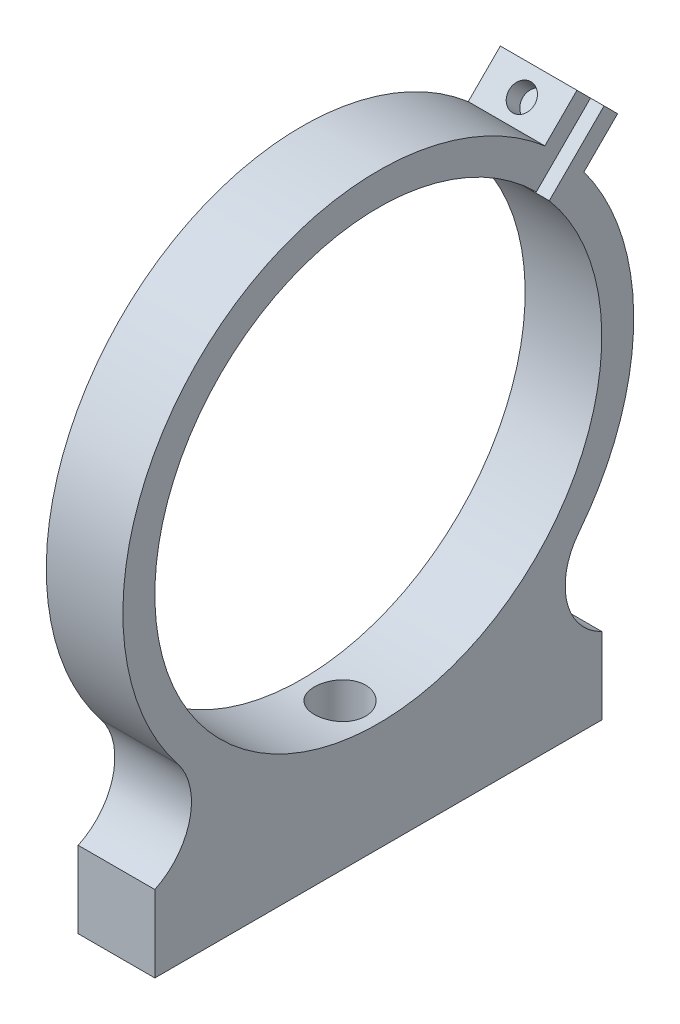
ISO-10303-21;
HEADER;
FILE_DESCRIPTION(('STEP AP214'),'2;1');
FILE_NAME('part.step','',(''),(''),'','','');
FILE_SCHEMA(('AUTOMOTIVE_DESIGN { 1 0 10303 214 1 1 1 1 }'));
ENDSEC;
DATA;
#1=APPLICATION_CONTEXT('core data for automotive mechanical design processes');
#2=APPLICATION_PROTOCOL_DEFINITION('international standard','automotive_design',2000,#1);
#3=PRODUCT_CONTEXT('',#1,'mechanical');
#4=PRODUCT('Part','Part','',(#3));
#5=PRODUCT_RELATED_PRODUCT_CATEGORY('part','',(#4));
#6=PRODUCT_DEFINITION_FORMATION('','',#4);
#7=PRODUCT_DEFINITION_CONTEXT('part definition',#1,'design');
#8=PRODUCT_DEFINITION('design','',#6,#7);
#9=PRODUCT_DEFINITION_SHAPE('','',#8);
#10=(LENGTH_UNIT() NAMED_UNIT(*) SI_UNIT(.MILLI.,.METRE.));
#11=(NAMED_UNIT(*) PLANE_ANGLE_UNIT() SI_UNIT($,.RADIAN.));
#12=(NAMED_UNIT(*) SI_UNIT($,.STERADIAN.) SOLID_ANGLE_UNIT());
#13=UNCERTAINTY_MEASURE_WITH_UNIT(LENGTH_MEASURE(1.E-05),#10,'distance_accuracy_value','');
#14=(GEOMETRIC_REPRESENTATION_CONTEXT(3) GLOBAL_UNCERTAINTY_ASSIGNED_CONTEXT((#13)) GLOBAL_UNIT_ASSIGNED_CONTEXT((#10,
#11,#12)) REPRESENTATION_CONTEXT('',''));
#15=CARTESIAN_POINT('',(0.,0.,0.));
#16=DIRECTION('',(0.,0.,1.));
#17=DIRECTION('',(1.,0.,0.));
#18=AXIS2_PLACEMENT_3D('',#15,#16,#17);
#19=CARTESIAN_POINT('',(12.,0.,0.));
#20=DIRECTION('',(-1.,0.,0.));
#21=DIRECTION('',(0.,0.,1.));
#22=AXIS2_PLACEMENT_3D('',#19,#20,#21);
#23=CYLINDRICAL_SURFACE('',#22,35.);
#24=CARTESIAN_POINT('',(6.,-34.7706773014274,-4.));
#25=CARTESIAN_POINT('',(5.7761068212435,-34.7706802703083,-3.99999039467116));
#26=CARTESIAN_POINT('',(5.55207001012186,-34.7728631484643,-3.98113856502669));
#27=CARTESIAN_POINT('',(5.1102206565733,-34.7813564645371,-3.9062268954558));
#28=CARTESIAN_POINT('',(4.89241504098576,-34.7876713228225,-3.85012720703826));
#29=CARTESIAN_POINT('',(4.46948993945215,-34.8037041868618,-3.70238593179485));
#30=CARTESIAN_POINT('',(4.26436236143181,-34.813419994922,-3.61076729321481));
#31=CARTESIAN_POINT('',(3.87243586790524,-34.8351573627681,-3.39463576991957));
#32=CARTESIAN_POINT('',(3.6856335974635,-34.8471784993072,-3.27012892173724));
#33=CARTESIAN_POINT('',(3.33474087257737,-34.8722353639043,-2.99112737670789));
#34=CARTESIAN_POINT('',(3.17074894416863,-34.8852751352186,-2.83650911647623));
#35=CARTESIAN_POINT('',(2.87098195501213,-34.9108635166589,-2.5019390964855));
#36=CARTESIAN_POINT('',(2.73520824578831,-34.923412103236,-2.3219861240014));
#37=CARTESIAN_POINT('',(2.49538351881743,-34.9466450561789,-1.94124182052728));
#38=CARTESIAN_POINT('',(2.39142088392515,-34.9573241939749,-1.74039447240944));
#39=CARTESIAN_POINT('',(2.21873518788249,-34.9755707360662,-1.32394994641983));
#40=CARTESIAN_POINT('',(2.1500110239348,-34.9831382377393,-1.10835323037283));
#41=CARTESIAN_POINT('',(2.05004531494299,-34.9942804148453,-0.669533116576047));
#42=CARTESIAN_POINT('',(2.01864070285107,-34.9978724562082,-0.446347314389196));
#43=CARTESIAN_POINT('',(1.99370055715837,-35.0007181877996,0.0021538276511191));
#44=CARTESIAN_POINT('',(2.00016376478714,-34.9999720222351,0.22746909647006));
#45=CARTESIAN_POINT('',(2.0506443454454,-34.994239535094,0.672724975699361));
#46=CARTESIAN_POINT('',(2.09448635916776,-34.9892730132982,0.89268575800654));
#47=CARTESIAN_POINT('',(2.21820634099248,-34.975680309984,1.32210689095957));
#48=CARTESIAN_POINT('',(2.2980848974135,-34.9670540687184,1.5315670701146));
#49=CARTESIAN_POINT('',(2.49179961804813,-34.9470773029527,1.93458857607151));
#50=CARTESIAN_POINT('',(2.60571244798582,-34.9357206392944,2.1281127363809));
#51=CARTESIAN_POINT('',(2.86420643111326,-34.9115553238363,2.49336327835365));
#52=CARTESIAN_POINT('',(3.00878876033528,-34.8987466163661,2.66508882373807));
#53=CARTESIAN_POINT('',(3.32550161102439,-34.873026081976,2.98289630473208));
#54=CARTESIAN_POINT('',(3.49778483579986,-34.8601140840558,3.1288260915369));
#55=CARTESIAN_POINT('',(3.86448221533819,-34.8357148223388,3.38971922893476));
#56=CARTESIAN_POINT('',(4.05889642056977,-34.8242275617911,3.50468250890804));
#57=CARTESIAN_POINT('',(4.4644641205131,-34.8039780876175,3.70038363069898));
#58=CARTESIAN_POINT('',(4.67562292816056,-34.7952167432806,3.78111055758808));
#59=CARTESIAN_POINT('',(5.10862115306622,-34.7814285795233,3.90591914892376));
#60=CARTESIAN_POINT('',(5.33046014210998,-34.7764016105083,3.9500022812855));
#61=CARTESIAN_POINT('',(5.7771814479859,-34.7706781399708,4.00007306869569));
#62=CARTESIAN_POINT('',(6.00203953099803,-34.7699573646219,4.00627426702509));
#63=CARTESIAN_POINT('',(6.44959145182389,-34.7728637648406,3.98096740049736));
#64=CARTESIAN_POINT('',(6.67228532796551,-34.7764908632657,3.94946000468712));
#65=CARTESIAN_POINT('',(7.10855542086367,-34.7876622156734,3.84980961486248));
#66=CARTESIAN_POINT('',(7.32215530711442,-34.7951955302073,3.78176891441823));
#67=CARTESIAN_POINT('',(7.73491241771214,-34.8133216435929,3.6110882413808));
#68=CARTESIAN_POINT('',(7.93406921397966,-34.823914533081,3.50844724377658));
#69=CARTESIAN_POINT('',(8.31325624012628,-34.8470246907964,3.2709500352039));
#70=CARTESIAN_POINT('',(8.49319782571245,-34.8595502765903,3.13595311740981));
#71=CARTESIAN_POINT('',(8.82794461651725,-34.8850879181841,2.83777629642368));
#72=CARTESIAN_POINT('',(8.98274900655206,-34.8980999897435,2.67459547959911));
#73=CARTESIAN_POINT('',(9.26357096634907,-34.9232184755517,2.32375303711081));
#74=CARTESIAN_POINT('',(9.3894486754033,-34.9353203069102,2.13597908941084));
#75=CARTESIAN_POINT('',(9.60787875838727,-34.9571870972036,1.74183070278072));
#76=CARTESIAN_POINT('',(9.7004317080374,-34.9669520965088,1.53545658526514));
#77=CARTESIAN_POINT('',(9.84935132247975,-34.9830244863733,1.11044146010142));
#78=CARTESIAN_POINT('',(9.90580047012383,-34.9893397533456,0.891829663421387));
#79=CARTESIAN_POINT('',(9.98117883903854,-34.9978336616981,0.448154432438734));
#80=CARTESIAN_POINT('',(10.0001094610877,-35.000012457516,0.223091239321473));
#81=CARTESIAN_POINT('',(9.99989020500468,-34.999987504025,-0.225728802506267));
#82=CARTESIAN_POINT('',(9.98095664090114,-34.9978086494999,-0.449485789390091));
#83=CARTESIAN_POINT('',(9.90600254268488,-34.9893624975444,-0.890616757601722));
#84=CARTESIAN_POINT('',(9.8499820068801,-34.9830951999275,-1.10799073863831));
#85=CARTESIAN_POINT('',(9.70250857055643,-34.9671736623452,-1.53016886215845));
#86=CARTESIAN_POINT('',(9.61106423306853,-34.9575202409641,-1.73497602858131));
#87=CARTESIAN_POINT('',(9.39536146704139,-34.9358986274364,-2.12637074539135));
#88=CARTESIAN_POINT('',(9.27110291048448,-34.9239304262592,-2.31295822469444));
#89=CARTESIAN_POINT('',(8.99249297642326,-34.8989356953959,-2.66372421222052));
#90=CARTESIAN_POINT('',(8.83798043639415,-34.8859037259505,-2.82777432841177));
#91=CARTESIAN_POINT('',(8.5035780336243,-34.8602950731462,-3.12770660188442));
#92=CARTESIAN_POINT('',(8.32368213628618,-34.8477184989482,-3.26358204193995));
#93=CARTESIAN_POINT('',(7.9429607527124,-34.8244010422005,-3.50367435231808));
#94=CARTESIAN_POINT('',(7.74206920133141,-34.8136662530677,-3.60778698910655));
#95=CARTESIAN_POINT('',(7.32565132532037,-34.7953195812538,-3.78065607775438));
#96=CARTESIAN_POINT('',(7.11014148774519,-34.787704246413,-3.84945163491187));
#97=CARTESIAN_POINT('',(6.74455574623474,-34.7783405152811,-3.93294952761367));
#98=CARTESIAN_POINT('',(6.59680090965969,-34.7754807895464,-3.95805812405689));
#99=CARTESIAN_POINT('',(6.29938545217942,-34.7716481955277,-3.9915865223948));
#100=CARTESIAN_POINT('',(6.14972484259795,-34.7706753160377,-4.00000642340404));
#101=CARTESIAN_POINT('',(6.,-34.7706773014274,-4.));
#102=B_SPLINE_CURVE_WITH_KNOTS('',3,(#24,#25,#26,#27,#28,#29,#30,#31,#32,#33,#34,#35,#36,#37,
#38,#39,#40,#41,#42,#43,#44,#45,#46,#47,#48,#49,#50,#51,#52,#53,#54,#55,#56,#57,#58,#59,#60,#61,
#62,#63,#64,#65,#66,#67,#68,#69,#70,#71,#72,#73,#74,#75,#76,#77,#78,#79,#80,#81,#82,#83,#84,#85,
#86,#87,#88,#89,#90,#91,#92,#93,#94,#95,#96,#97,#98,#99,#100,#101),.UNSPECIFIED.,.T.,.F.,(4,2,2,
2,2,2,2,2,2,2,2,2,2,2,2,2,2,2,2,2,2,2,2,2,2,2,2,2,2,2,2,2,2,2,2,2,2,2,4),(0.,0.671132661356251,
1.34298447299695,2.01440293300388,2.68569824168313,3.35980860054972,4.03395123879007,
4.70995023300515,5.38592807036064,6.05894124620633,6.73193205043704,7.40178284315469,
8.07164457199327,8.74302675855931,9.4144346941566,10.089679405272,10.7649256562837,
11.4403870217432,12.115821327566,12.7874446199849,13.4590559962658,14.1287965872874,
14.7985570206771,15.4712846585858,16.1440341082833,16.8199709026657,17.4958960189666,
18.170271346141,18.8446214946008,19.5151301582838,20.1856388525582,20.8559855651356,
21.5263348929659,22.2003573944704,22.8745404078068,23.5509126098685,24.2265342658145,
24.6753457456079,25.1241545598916),.UNSPECIFIED.);
#103=CARTESIAN_POINT('',(6.,-34.7706773014274,-4.));
#104=VERTEX_POINT('',#103);
#105=EDGE_CURVE('E219',#104,#104,#102,.T.);
#106=ORIENTED_EDGE('',*,*,#105,.F.);
#107=EDGE_LOOP('',(#106));
#108=FACE_BOUND('',#107,.T.);
#109=CARTESIAN_POINT('',(0.,0.,0.));
#110=DIRECTION('',(1.,0.,0.));
#111=DIRECTION('',(0.,0.,-1.));
#112=AXIS2_PLACEMENT_3D('',#109,#110,#111);
#113=CIRCLE('',#112,35.);
#114=CARTESIAN_POINT('',(0.,24.7487373415292,-24.7487373415292));
#115=VERTEX_POINT('',#114);
#116=CARTESIAN_POINT('',(0.,22.5363356683163,-26.7789763554356));
#117=VERTEX_POINT('',#116);
#118=EDGE_CURVE('E178',#115,#117,#113,.T.);
#119=ORIENTED_EDGE('',*,*,#118,.F.);
#120=DIRECTION('',(1.,0.,0.));
#121=VECTOR('',#120,1.);
#122=CARTESIAN_POINT('',(0.,24.7487373415292,-24.7487373415292));
#123=LINE('',#122,#121);
#124=CARTESIAN_POINT('',(12.,24.7487373415292,-24.7487373415292));
#125=VERTEX_POINT('',#124);
#126=EDGE_CURVE('E181',#115,#125,#123,.T.);
#127=ORIENTED_EDGE('',*,*,#126,.T.);
#128=CARTESIAN_POINT('',(12.,0.,0.));
#129=DIRECTION('',(1.,0.,0.));
#130=DIRECTION('',(0.,0.,-1.));
#131=AXIS2_PLACEMENT_3D('',#128,#129,#130);
#132=CIRCLE('',#131,35.);
#133=CARTESIAN_POINT('',(12.,22.5363356683163,-26.7789763554356));
#134=VERTEX_POINT('',#133);
#135=EDGE_CURVE('E180',#125,#134,#132,.T.);
#136=ORIENTED_EDGE('',*,*,#135,.T.);
#137=DIRECTION('',(1.,0.,0.));
#138=VECTOR('',#137,1.);
#139=CARTESIAN_POINT('',(0.,22.5363356683163,-26.7789763554356));
#140=LINE('',#139,#138);
#141=EDGE_CURVE('E165',#117,#134,#140,.T.);
#142=ORIENTED_EDGE('',*,*,#141,.F.);
#143=EDGE_LOOP('',(#119,#127,#136,#142));
#144=FACE_BOUND('',#143,.T.);
#145=ADVANCED_FACE('F59',(#108,#144),#23,.F.);
#146=CARTESIAN_POINT('',(12.,0.,0.));
#147=DIRECTION('',(1.,0.,0.));
#148=DIRECTION('',(0.,0.,-1.));
#149=AXIS2_PLACEMENT_3D('',#146,#147,#148);
#150=PLANE('',#149);
#151=ORIENTED_EDGE('',*,*,#135,.F.);
#152=DIRECTION('',(0.,0.707106781186548,-0.707106781186548));
#153=VECTOR('',#152,1.);
#154=CARTESIAN_POINT('',(12.,0.,0.));
#155=LINE('',#154,#153);
#156=CARTESIAN_POINT('',(12.,33.2340187157677,-33.2340187157677));
#157=VERTEX_POINT('',#156);
#158=EDGE_CURVE('E315',#125,#157,#155,.T.);
#159=ORIENTED_EDGE('',*,*,#158,.T.);
#160=DIRECTION('',(0.,0.707106781186548,0.707106781186547));
#161=VECTOR('',#160,1.);
#162=CARTESIAN_POINT('',(12.,33.2340187157677,-33.2340187157678));
#163=LINE('',#162,#161);
#164=CARTESIAN_POINT('',(12.,35.3553390593274,-31.1126983722081));
#165=VERTEX_POINT('',#164);
#166=EDGE_CURVE('E319',#157,#165,#163,.T.);
#167=ORIENTED_EDGE('',*,*,#166,.T.);
#168=DIRECTION('',(0.,-0.707106781186548,0.707106781186548));
#169=VECTOR('',#168,1.);
#170=CARTESIAN_POINT('',(12.,2.12132034355964,2.12132034355964));
#171=LINE('',#170,#169);
#172=CARTESIAN_POINT('',(12.,30.3259298959006,-26.0832892087813));
#173=VERTEX_POINT('',#172);
#174=EDGE_CURVE('E322',#165,#173,#171,.T.);
#175=ORIENTED_EDGE('',*,*,#174,.T.);
#176=CARTESIAN_POINT('',(12.,0.,0.));
#177=DIRECTION('',(1.,0.,0.));
#178=DIRECTION('',(0.,0.,-1.));
#179=AXIS2_PLACEMENT_3D('',#176,#177,#178);
#180=CIRCLE('',#179,40.);
#181=CARTESIAN_POINT('',(12.,-24.7642397561297,31.412297421566));
#182=VERTEX_POINT('',#181);
#183=EDGE_CURVE('E189',#173,#182,#180,.T.);
#184=ORIENTED_EDGE('',*,*,#183,.T.);
#185=CARTESIAN_POINT('',(12.,-30.9552996951621,39.2653717769576));
#186=DIRECTION('',(1.,0.,0.));
#187=DIRECTION('',(0.,0.,-1.));
#188=AXIS2_PLACEMENT_3D('',#185,#186,#187);
#189=CIRCLE('',#188,10.);
#190=CARTESIAN_POINT('',(12.,-40.,35.));
#191=VERTEX_POINT('',#190);
#192=EDGE_CURVE('E12',#182,#191,#189,.F.);
#193=ORIENTED_EDGE('',*,*,#192,.T.);
#194=DIRECTION('',(0.,1.,0.));
#195=VECTOR('',#194,1.);
#196=CARTESIAN_POINT('',(12.,0.,35.));
#197=LINE('',#196,#195);
#198=CARTESIAN_POINT('',(12.,-52.,35.));
#199=VERTEX_POINT('',#198);
#200=EDGE_CURVE('E271',#199,#191,#197,.T.);
#201=ORIENTED_EDGE('',*,*,#200,.F.);
#202=DIRECTION('',(0.,0.,1.));
#203=VECTOR('',#202,1.);
#204=CARTESIAN_POINT('',(12.,-52.,0.));
#205=LINE('',#204,#203);
#206=CARTESIAN_POINT('',(12.,-52.,-35.));
#207=VERTEX_POINT('',#206);
#208=EDGE_CURVE('E274',#207,#199,#205,.T.);
#209=ORIENTED_EDGE('',*,*,#208,.F.);
#210=DIRECTION('',(0.,-1.,0.));
#211=VECTOR('',#210,1.);
#212=CARTESIAN_POINT('',(12.,0.,-35.));
#213=LINE('',#212,#211);
#214=CARTESIAN_POINT('',(12.,-40.,-35.));
#215=VERTEX_POINT('',#214);
#216=EDGE_CURVE('E277',#215,#207,#213,.T.);
#217=ORIENTED_EDGE('',*,*,#216,.F.);
#218=CARTESIAN_POINT('',(12.,-30.9552996951621,-39.2653717769576));
#219=DIRECTION('',(1.,0.,0.));
#220=DIRECTION('',(0.,0.,-1.));
#221=AXIS2_PLACEMENT_3D('',#218,#219,#220);
#222=CIRCLE('',#221,10.);
#223=CARTESIAN_POINT('',(12.,-24.7642397561297,-31.4122974215661));
#224=VERTEX_POINT('',#223);
#225=EDGE_CURVE('E216',#215,#224,#222,.F.);
#226=ORIENTED_EDGE('',*,*,#225,.T.);
#227=CARTESIAN_POINT('',(12.,23.7216222210999,-32.2069035953384));
#228=VERTEX_POINT('',#227);
#229=EDGE_CURVE('E192',#224,#228,#180,.T.);
#230=ORIENTED_EDGE('',*,*,#229,.T.);
#231=DIRECTION('',(0.,-0.707106781186547,0.707106781186548));
#232=VECTOR('',#231,1.);
#233=CARTESIAN_POINT('',(12.,-4.24264068711925,-4.24264068711924));
#234=LINE('',#233,#232);
#235=CARTESIAN_POINT('',(12.,28.9913780286484,-37.476659402887));
#236=VERTEX_POINT('',#235);
#237=EDGE_CURVE('E331',#236,#228,#234,.T.);
#238=ORIENTED_EDGE('',*,*,#237,.F.);
#239=DIRECTION('',(0.,-0.707106781186547,-0.707106781186548));
#240=VECTOR('',#239,1.);
#241=CARTESIAN_POINT('',(12.,33.2340187157678,-33.2340187157677));
#242=LINE('',#241,#240);
#243=CARTESIAN_POINT('',(12.,31.1126983722081,-35.3553390593274));
#244=VERTEX_POINT('',#243);
#245=EDGE_CURVE('E334',#244,#236,#242,.T.);
#246=ORIENTED_EDGE('',*,*,#245,.F.);
#247=DIRECTION('',(0.,0.707106781186547,-0.707106781186548));
#248=VECTOR('',#247,1.);
#249=CARTESIAN_POINT('',(12.,-2.12132034355964,-2.12132034355964));
#250=LINE('',#249,#248);
#251=EDGE_CURVE('E341',#134,#244,#250,.T.);
#252=ORIENTED_EDGE('',*,*,#251,.F.);
#253=EDGE_LOOP('',(#151,#159,#167,#175,#184,#193,#201,#209,#217,#226,#230,#238,#246,#252));
#254=FACE_BOUND('',#253,.T.);
#255=ADVANCED_FACE('F242',(#254),#150,.T.);
#256=CARTESIAN_POINT('',(0.,0.,0.));
#257=DIRECTION('',(1.,0.,0.));
#258=DIRECTION('',(0.,0.,-1.));
#259=AXIS2_PLACEMENT_3D('',#256,#257,#258);
#260=PLANE('',#259);
#261=DIRECTION('',(0.,0.707106781186548,-0.707106781186548));
#262=VECTOR('',#261,1.);
#263=CARTESIAN_POINT('',(0.,0.,0.));
#264=LINE('',#263,#262);
#265=CARTESIAN_POINT('',(0.,33.2340187157677,-33.2340187157677));
#266=VERTEX_POINT('',#265);
#267=EDGE_CURVE('E187',#115,#266,#264,.T.);
#268=ORIENTED_EDGE('',*,*,#267,.F.);
#269=ORIENTED_EDGE('',*,*,#118,.T.);
#270=DIRECTION('',(0.,0.707106781186547,-0.707106781186548));
#271=VECTOR('',#270,1.);
#272=CARTESIAN_POINT('',(0.,-2.12132034355964,-2.12132034355964));
#273=LINE('',#272,#271);
#274=CARTESIAN_POINT('',(0.,31.1126983722081,-35.3553390593274));
#275=VERTEX_POINT('',#274);
#276=EDGE_CURVE('E162',#117,#275,#273,.T.);
#277=ORIENTED_EDGE('',*,*,#276,.T.);
#278=DIRECTION('',(0.,-0.707106781186547,-0.707106781186548));
#279=VECTOR('',#278,1.);
#280=CARTESIAN_POINT('',(0.,33.2340187157678,-33.2340187157677));
#281=LINE('',#280,#279);
#282=CARTESIAN_POINT('',(0.,28.9913780286484,-37.476659402887));
#283=VERTEX_POINT('',#282);
#284=EDGE_CURVE('E173',#275,#283,#281,.T.);
#285=ORIENTED_EDGE('',*,*,#284,.T.);
#286=DIRECTION('',(0.,-0.707106781186547,0.707106781186548));
#287=VECTOR('',#286,1.);
#288=CARTESIAN_POINT('',(0.,-4.24264068711925,-4.24264068711924));
#289=LINE('',#288,#287);
#290=CARTESIAN_POINT('',(0.,23.7216222210999,-32.2069035953384));
#291=VERTEX_POINT('',#290);
#292=EDGE_CURVE('E339',#283,#291,#289,.T.);
#293=ORIENTED_EDGE('',*,*,#292,.T.);
#294=CARTESIAN_POINT('',(0.,0.,0.));
#295=DIRECTION('',(1.,0.,0.));
#296=DIRECTION('',(0.,0.,-1.));
#297=AXIS2_PLACEMENT_3D('',#294,#295,#296);
#298=CIRCLE('',#297,40.);
#299=CARTESIAN_POINT('',(0.,-24.7642397561297,-31.4122974215661));
#300=VERTEX_POINT('',#299);
#301=EDGE_CURVE('E81',#300,#291,#298,.T.);
#302=ORIENTED_EDGE('',*,*,#301,.F.);
#303=CARTESIAN_POINT('',(0.,-30.9552996951621,-39.2653717769576));
#304=DIRECTION('',(1.,0.,0.));
#305=DIRECTION('',(0.,0.,-1.));
#306=AXIS2_PLACEMENT_3D('',#303,#304,#305);
#307=CIRCLE('',#306,10.);
#308=CARTESIAN_POINT('',(0.,-40.,-35.));
#309=VERTEX_POINT('',#308);
#310=EDGE_CURVE('E214',#300,#309,#307,.T.);
#311=ORIENTED_EDGE('',*,*,#310,.T.);
#312=DIRECTION('',(0.,-1.,0.));
#313=VECTOR('',#312,1.);
#314=CARTESIAN_POINT('',(0.,0.,-35.));
#315=LINE('',#314,#313);
#316=CARTESIAN_POINT('',(0.,-52.,-35.));
#317=VERTEX_POINT('',#316);
#318=EDGE_CURVE('E190',#309,#317,#315,.T.);
#319=ORIENTED_EDGE('',*,*,#318,.T.);
#320=DIRECTION('',(0.,0.,1.));
#321=VECTOR('',#320,1.);
#322=CARTESIAN_POINT('',(0.,-52.,0.));
#323=LINE('',#322,#321);
#324=CARTESIAN_POINT('',(0.,-52.,35.));
#325=VERTEX_POINT('',#324);
#326=EDGE_CURVE('E195',#317,#325,#323,.T.);
#327=ORIENTED_EDGE('',*,*,#326,.T.);
#328=DIRECTION('',(0.,1.,0.));
#329=VECTOR('',#328,1.);
#330=CARTESIAN_POINT('',(0.,0.,35.));
#331=LINE('',#330,#329);
#332=CARTESIAN_POINT('',(0.,-40.,35.));
#333=VERTEX_POINT('',#332);
#334=EDGE_CURVE('E282',#325,#333,#331,.T.);
#335=ORIENTED_EDGE('',*,*,#334,.T.);
#336=CARTESIAN_POINT('',(0.,-30.9552996951621,39.2653717769576));
#337=DIRECTION('',(1.,0.,0.));
#338=DIRECTION('',(0.,0.,-1.));
#339=AXIS2_PLACEMENT_3D('',#336,#337,#338);
#340=CIRCLE('',#339,10.);
#341=CARTESIAN_POINT('',(0.,-24.7642397561297,31.412297421566));
#342=VERTEX_POINT('',#341);
#343=EDGE_CURVE('E68',#333,#342,#340,.T.);
#344=ORIENTED_EDGE('',*,*,#343,.T.);
#345=CARTESIAN_POINT('',(0.,30.3259298959006,-26.0832892087813));
#346=VERTEX_POINT('',#345);
#347=EDGE_CURVE('E269',#346,#342,#298,.T.);
#348=ORIENTED_EDGE('',*,*,#347,.F.);
#349=DIRECTION('',(0.,-0.707106781186548,0.707106781186548));
#350=VECTOR('',#349,1.);
#351=CARTESIAN_POINT('',(0.,2.12132034355964,2.12132034355964));
#352=LINE('',#351,#350);
#353=CARTESIAN_POINT('',(0.,35.3553390593274,-31.1126983722081));
#354=VERTEX_POINT('',#353);
#355=EDGE_CURVE('E301',#354,#346,#352,.T.);
#356=ORIENTED_EDGE('',*,*,#355,.F.);
#357=DIRECTION('',(0.,0.707106781186548,0.707106781186547));
#358=VECTOR('',#357,1.);
#359=CARTESIAN_POINT('',(0.,33.2340187157677,-33.2340187157678));
#360=LINE('',#359,#358);
#361=EDGE_CURVE('E312',#266,#354,#360,.T.);
#362=ORIENTED_EDGE('',*,*,#361,.F.);
#363=EDGE_LOOP('',(#268,#269,#277,#285,#293,#302,#311,#319,#327,#335,#344,#348,#356,#362));
#364=FACE_BOUND('',#363,.T.);
#365=ADVANCED_FACE('F184',(#364),#260,.F.);
#366=CARTESIAN_POINT('',(12.,0.,0.));
#367=DIRECTION('',(-1.,0.,0.));
#368=DIRECTION('',(0.,0.,1.));
#369=AXIS2_PLACEMENT_3D('',#366,#367,#368);
#370=CYLINDRICAL_SURFACE('',#369,40.);
#371=DIRECTION('',(1.,0.,0.));
#372=VECTOR('',#371,1.);
#373=CARTESIAN_POINT('',(0.,23.7216222210999,-32.2069035953384));
#374=LINE('',#373,#372);
#375=EDGE_CURVE('E76',#291,#228,#374,.T.);
#376=ORIENTED_EDGE('',*,*,#375,.T.);
#377=ORIENTED_EDGE('',*,*,#229,.F.);
#378=DIRECTION('',(-1.,0.,0.));
#379=VECTOR('',#378,1.);
#380=CARTESIAN_POINT('',(12.,-24.7642397561297,-31.4122974215661));
#381=LINE('',#380,#379);
#382=EDGE_CURVE('E212',#224,#300,#381,.T.);
#383=ORIENTED_EDGE('',*,*,#382,.T.);
#384=ORIENTED_EDGE('',*,*,#301,.T.);
#385=EDGE_LOOP('',(#376,#377,#383,#384));
#386=FACE_BOUND('',#385,.T.);
#387=ADVANCED_FACE('F246',(#386),#370,.T.);
#388=ORIENTED_EDGE('',*,*,#183,.F.);
#389=DIRECTION('',(1.,0.,0.));
#390=VECTOR('',#389,1.);
#391=CARTESIAN_POINT('',(0.,30.3259298959006,-26.0832892087813));
#392=LINE('',#391,#390);
#393=EDGE_CURVE('E305',#346,#173,#392,.T.);
#394=ORIENTED_EDGE('',*,*,#393,.F.);
#395=ORIENTED_EDGE('',*,*,#347,.T.);
#396=DIRECTION('',(-1.,0.,0.));
#397=VECTOR('',#396,1.);
#398=CARTESIAN_POINT('',(12.,-24.7642397561297,31.412297421566));
#399=LINE('',#398,#397);
#400=EDGE_CURVE('E209',#342,#182,#399,.F.);
#401=ORIENTED_EDGE('',*,*,#400,.T.);
#402=EDGE_LOOP('',(#388,#394,#395,#401));
#403=FACE_BOUND('',#402,.T.);
#404=ADVANCED_FACE('F250',(#403),#370,.T.);
#405=CARTESIAN_POINT('',(12.,0.,35.));
#406=DIRECTION('',(0.,0.,1.));
#407=DIRECTION('',(1.,0.,0.));
#408=AXIS2_PLACEMENT_3D('',#405,#406,#407);
#409=PLANE('',#408);
#410=ORIENTED_EDGE('',*,*,#334,.F.);
#411=DIRECTION('',(-1.,0.,0.));
#412=VECTOR('',#411,1.);
#413=CARTESIAN_POINT('',(12.,-52.,35.));
#414=LINE('',#413,#412);
#415=EDGE_CURVE('E204',#199,#325,#414,.T.);
#416=ORIENTED_EDGE('',*,*,#415,.F.);
#417=ORIENTED_EDGE('',*,*,#200,.T.);
#418=DIRECTION('',(-1.,0.,0.));
#419=VECTOR('',#418,1.);
#420=CARTESIAN_POINT('',(12.,-40.,35.));
#421=LINE('',#420,#419);
#422=EDGE_CURVE('E206',#191,#333,#421,.T.);
#423=ORIENTED_EDGE('',*,*,#422,.T.);
#424=EDGE_LOOP('',(#410,#416,#417,#423));
#425=FACE_BOUND('',#424,.T.);
#426=ADVANCED_FACE('F293',(#425),#409,.T.);
#427=CARTESIAN_POINT('',(12.,-52.,0.));
#428=DIRECTION('',(0.,-1.,0.));
#429=DIRECTION('',(0.,0.,-1.));
#430=AXIS2_PLACEMENT_3D('',#427,#428,#429);
#431=PLANE('',#430);
#432=CARTESIAN_POINT('',(6.,-52.,0.));
#433=DIRECTION('',(0.,-1.,0.));
#434=DIRECTION('',(0.,0.,-1.));
#435=AXIS2_PLACEMENT_3D('',#432,#433,#434);
#436=CIRCLE('',#435,2.);
#437=CARTESIAN_POINT('',(6.,-52.,-2.));
#438=VERTEX_POINT('',#437);
#439=EDGE_CURVE('E225',#438,#438,#436,.T.);
#440=ORIENTED_EDGE('',*,*,#439,.F.);
#441=EDGE_LOOP('',(#440));
#442=FACE_BOUND('',#441,.T.);
#443=ORIENTED_EDGE('',*,*,#326,.F.);
#444=DIRECTION('',(-1.,0.,0.));
#445=VECTOR('',#444,1.);
#446=CARTESIAN_POINT('',(12.,-52.,-35.));
#447=LINE('',#446,#445);
#448=EDGE_CURVE('E202',#207,#317,#447,.T.);
#449=ORIENTED_EDGE('',*,*,#448,.F.);
#450=ORIENTED_EDGE('',*,*,#208,.T.);
#451=ORIENTED_EDGE('',*,*,#415,.T.);
#452=EDGE_LOOP('',(#443,#449,#450,#451));
#453=FACE_BOUND('',#452,.T.);
#454=ADVANCED_FACE('F289',(#442,#453),#431,.T.);
#455=CARTESIAN_POINT('',(12.,0.,-35.));
#456=DIRECTION('',(0.,0.,-1.));
#457=DIRECTION('',(-1.,0.,0.));
#458=AXIS2_PLACEMENT_3D('',#455,#456,#457);
#459=PLANE('',#458);
#460=ORIENTED_EDGE('',*,*,#318,.F.);
#461=DIRECTION('',(-1.,0.,0.));
#462=VECTOR('',#461,1.);
#463=CARTESIAN_POINT('',(12.,-40.,-35.));
#464=LINE('',#463,#462);
#465=EDGE_CURVE('E199',#215,#309,#464,.T.);
#466=ORIENTED_EDGE('',*,*,#465,.F.);
#467=ORIENTED_EDGE('',*,*,#216,.T.);
#468=ORIENTED_EDGE('',*,*,#448,.T.);
#469=EDGE_LOOP('',(#460,#466,#467,#468));
#470=FACE_BOUND('',#469,.T.);
#471=ADVANCED_FACE('F360',(#470),#459,.T.);
#472=CARTESIAN_POINT('',(12.,-30.9552996951621,-39.2653717769576));
#473=DIRECTION('',(1.,0.,0.));
#474=DIRECTION('',(0.,0.,-1.));
#475=AXIS2_PLACEMENT_3D('',#472,#473,#474);
#476=CYLINDRICAL_SURFACE('',#475,10.);
#477=ORIENTED_EDGE('',*,*,#225,.F.);
#478=ORIENTED_EDGE('',*,*,#465,.T.);
#479=ORIENTED_EDGE('',*,*,#310,.F.);
#480=ORIENTED_EDGE('',*,*,#382,.F.);
#481=EDGE_LOOP('',(#477,#478,#479,#480));
#482=FACE_BOUND('',#481,.T.);
#483=ADVANCED_FACE('F358',(#482),#476,.F.);
#484=CARTESIAN_POINT('',(12.,-30.9552996951621,39.2653717769576));
#485=DIRECTION('',(1.,0.,0.));
#486=DIRECTION('',(0.,0.,-1.));
#487=AXIS2_PLACEMENT_3D('',#484,#485,#486);
#488=CYLINDRICAL_SURFACE('',#487,10.);
#489=ORIENTED_EDGE('',*,*,#192,.F.);
#490=ORIENTED_EDGE('',*,*,#400,.F.);
#491=ORIENTED_EDGE('',*,*,#343,.F.);
#492=ORIENTED_EDGE('',*,*,#422,.F.);
#493=EDGE_LOOP('',(#489,#490,#491,#492));
#494=FACE_BOUND('',#493,.T.);
#495=ADVANCED_FACE('F61',(#494),#488,.F.);
#496=CARTESIAN_POINT('',(6.,-25.,0.));
#497=DIRECTION('',(0.,-1.,0.));
#498=DIRECTION('',(0.,0.,-1.));
#499=AXIS2_PLACEMENT_3D('',#496,#497,#498);
#500=CYLINDRICAL_SURFACE('',#499,2.);
#501=CARTESIAN_POINT('',(6.,-46.,0.));
#502=DIRECTION('',(0.,-1.,0.));
#503=DIRECTION('',(0.,0.,-1.));
#504=AXIS2_PLACEMENT_3D('',#501,#502,#503);
#505=CIRCLE('',#504,2.);
#506=CARTESIAN_POINT('',(6.,-46.,-2.));
#507=VERTEX_POINT('',#506);
#508=EDGE_CURVE('E261',#507,#507,#505,.T.);
#509=ORIENTED_EDGE('',*,*,#508,.F.);
#510=EDGE_LOOP('',(#509));
#511=FACE_BOUND('',#510,.T.);
#512=ORIENTED_EDGE('',*,*,#439,.T.);
#513=EDGE_LOOP('',(#512));
#514=FACE_BOUND('',#513,.T.);
#515=ADVANCED_FACE('F236',(#511,#514),#500,.F.);
#516=CARTESIAN_POINT('',(6.,-28.,0.));
#517=DIRECTION('',(0.,-1.,0.));
#518=DIRECTION('',(0.,0.,-1.));
#519=AXIS2_PLACEMENT_3D('',#516,#517,#518);
#520=CYLINDRICAL_SURFACE('',#519,4.);
#521=ORIENTED_EDGE('',*,*,#105,.T.);
#522=EDGE_LOOP('',(#521));
#523=FACE_BOUND('',#522,.T.);
#524=CARTESIAN_POINT('',(6.,-46.,0.));
#525=DIRECTION('',(0.,-1.,0.));
#526=DIRECTION('',(0.,0.,-1.));
#527=AXIS2_PLACEMENT_3D('',#524,#525,#526);
#528=CIRCLE('',#527,4.);
#529=CARTESIAN_POINT('',(6.,-46.,-4.));
#530=VERTEX_POINT('',#529);
#531=EDGE_CURVE('E226',#530,#530,#528,.T.);
#532=ORIENTED_EDGE('',*,*,#531,.T.);
#533=EDGE_LOOP('',(#532));
#534=FACE_BOUND('',#533,.T.);
#535=ADVANCED_FACE('F230',(#523,#534),#520,.F.);
#536=CARTESIAN_POINT('',(6.,-46.,0.));
#537=DIRECTION('',(0.,-1.,0.));
#538=DIRECTION('',(0.,0.,-1.));
#539=AXIS2_PLACEMENT_3D('',#536,#537,#538);
#540=PLANE('',#539);
#541=ORIENTED_EDGE('',*,*,#508,.T.);
#542=EDGE_LOOP('',(#541));
#543=FACE_BOUND('',#542,.T.);
#544=ORIENTED_EDGE('',*,*,#531,.F.);
#545=EDGE_LOOP('',(#544));
#546=FACE_BOUND('',#545,.T.);
#547=ADVANCED_FACE('F235',(#543,#546),#540,.F.);
#548=CARTESIAN_POINT('',(0.,33.2340187157677,-33.2340187157678));
#549=DIRECTION('',(0.,0.707106781186547,-0.707106781186548));
#550=DIRECTION('',(0.,0.707106781186548,0.707106781186547));
#551=AXIS2_PLACEMENT_3D('',#548,#549,#550);
#552=PLANE('',#551);
#553=ORIENTED_EDGE('',*,*,#166,.F.);
#554=DIRECTION('',(1.,0.,0.));
#555=VECTOR('',#554,1.);
#556=CARTESIAN_POINT('',(0.,33.2340187157677,-33.2340187157677));
#557=LINE('',#556,#555);
#558=EDGE_CURVE('E264',#266,#157,#557,.T.);
#559=ORIENTED_EDGE('',*,*,#558,.F.);
#560=ORIENTED_EDGE('',*,*,#361,.T.);
#561=DIRECTION('',(1.,0.,0.));
#562=VECTOR('',#561,1.);
#563=CARTESIAN_POINT('',(0.,35.3553390593274,-31.1126983722081));
#564=LINE('',#563,#562);
#565=EDGE_CURVE('E309',#354,#165,#564,.T.);
#566=ORIENTED_EDGE('',*,*,#565,.T.);
#567=EDGE_LOOP('',(#553,#559,#560,#566));
#568=FACE_BOUND('',#567,.T.);
#569=ADVANCED_FACE('F328',(#568),#552,.T.);
#570=CARTESIAN_POINT('',(0.,0.,0.));
#571=DIRECTION('',(0.,-0.707106781186547,-0.707106781186547));
#572=DIRECTION('',(0.,0.707106781186548,-0.707106781186548));
#573=AXIS2_PLACEMENT_3D('',#570,#571,#572);
#574=PLANE('',#573);
#575=CARTESIAN_POINT('',(6.,30.5991408119934,-30.5991408119934));
#576=DIRECTION('',(0.,-0.707106781186547,-0.707106781186547));
#577=DIRECTION('',(0.,0.707106781186548,-0.707106781186548));
#578=AXIS2_PLACEMENT_3D('',#575,#576,#577);
#579=CIRCLE('',#578,2.);
#580=CARTESIAN_POINT('',(6.,32.0133543743665,-32.0133543743665));
#581=VERTEX_POINT('',#580);
#582=EDGE_CURVE('E182',#581,#581,#579,.T.);
#583=ORIENTED_EDGE('',*,*,#582,.F.);
#584=EDGE_LOOP('',(#583));
#585=FACE_BOUND('',#584,.T.);
#586=ORIENTED_EDGE('',*,*,#158,.F.);
#587=ORIENTED_EDGE('',*,*,#126,.F.);
#588=ORIENTED_EDGE('',*,*,#267,.T.);
#589=ORIENTED_EDGE('',*,*,#558,.T.);
#590=EDGE_LOOP('',(#586,#587,#588,#589));
#591=FACE_BOUND('',#590,.T.);
#592=ADVANCED_FACE('F330',(#585,#591),#574,.T.);
#593=CARTESIAN_POINT('',(0.,2.12132034355964,2.12132034355964));
#594=DIRECTION('',(0.,0.707106781186547,0.707106781186547));
#595=DIRECTION('',(0.,-0.707106781186548,0.707106781186548));
#596=AXIS2_PLACEMENT_3D('',#593,#594,#595);
#597=PLANE('',#596);
#598=CARTESIAN_POINT('',(6.,32.7204611555531,-28.4778204684338));
#599=DIRECTION('',(0.,0.707106781186547,0.707106781186547));
#600=DIRECTION('',(0.,-0.707106781186548,0.707106781186548));
#601=AXIS2_PLACEMENT_3D('',#598,#599,#600);
#602=CIRCLE('',#601,2.);
#603=CARTESIAN_POINT('',(6.,34.1346747179262,-29.8920340308069));
#604=VERTEX_POINT('',#603);
#605=EDGE_CURVE('E555',#604,#604,#602,.T.);
#606=ORIENTED_EDGE('',*,*,#605,.F.);
#607=EDGE_LOOP('',(#606));
#608=FACE_BOUND('',#607,.T.);
#609=ORIENTED_EDGE('',*,*,#174,.F.);
#610=ORIENTED_EDGE('',*,*,#565,.F.);
#611=ORIENTED_EDGE('',*,*,#355,.T.);
#612=ORIENTED_EDGE('',*,*,#393,.T.);
#613=EDGE_LOOP('',(#609,#610,#611,#612));
#614=FACE_BOUND('',#613,.T.);
#615=ADVANCED_FACE('F311',(#608,#614),#597,.T.);
#616=CARTESIAN_POINT('',(0.,-4.24264068711925,-4.24264068711924));
#617=DIRECTION('',(0.,0.707106781186548,0.707106781186547));
#618=DIRECTION('',(0.,-0.707106781186547,0.707106781186548));
#619=AXIS2_PLACEMENT_3D('',#616,#617,#618);
#620=PLANE('',#619);
#621=CARTESIAN_POINT('',(6.,26.3565001248742,-34.8417814991127));
#622=DIRECTION('',(0.,-0.707106781186548,-0.707106781186547));
#623=DIRECTION('',(0.,0.707106781186547,-0.707106781186548));
#624=AXIS2_PLACEMENT_3D('',#621,#622,#623);
#625=CIRCLE('',#624,2.);
#626=CARTESIAN_POINT('',(6.,27.7707136872473,-36.2559950614858));
#627=VERTEX_POINT('',#626);
#628=EDGE_CURVE('E557',#627,#627,#625,.T.);
#629=ORIENTED_EDGE('',*,*,#628,.F.);
#630=EDGE_LOOP('',(#629));
#631=FACE_BOUND('',#630,.T.);
#632=ORIENTED_EDGE('',*,*,#237,.T.);
#633=ORIENTED_EDGE('',*,*,#375,.F.);
#634=ORIENTED_EDGE('',*,*,#292,.F.);
#635=DIRECTION('',(1.,0.,0.));
#636=VECTOR('',#635,1.);
#637=CARTESIAN_POINT('',(0.,28.9913780286484,-37.476659402887));
#638=LINE('',#637,#636);
#639=EDGE_CURVE('E172',#283,#236,#638,.T.);
#640=ORIENTED_EDGE('',*,*,#639,.T.);
#641=EDGE_LOOP('',(#632,#633,#634,#640));
#642=FACE_BOUND('',#641,.T.);
#643=ADVANCED_FACE('F351',(#631,#642),#620,.F.);
#644=CARTESIAN_POINT('',(0.,-2.12132034355964,-2.12132034355964));
#645=DIRECTION('',(0.,-0.707106781186547,-0.707106781186547));
#646=DIRECTION('',(0.,0.707106781186548,-0.707106781186548));
#647=AXIS2_PLACEMENT_3D('',#644,#645,#646);
#648=PLANE('',#647);
#649=CARTESIAN_POINT('',(6.,28.4778204684338,-32.7204611555531));
#650=DIRECTION('',(0.,-0.707106781186547,-0.707106781186547));
#651=DIRECTION('',(0.,0.707106781186548,-0.707106781186548));
#652=AXIS2_PLACEMENT_3D('',#649,#650,#651);
#653=CIRCLE('',#652,2.);
#654=CARTESIAN_POINT('',(6.,29.8920340308069,-34.1346747179262));
#655=VERTEX_POINT('',#654);
#656=EDGE_CURVE('E63',#655,#655,#653,.T.);
#657=ORIENTED_EDGE('',*,*,#656,.T.);
#658=EDGE_LOOP('',(#657));
#659=FACE_BOUND('',#658,.T.);
#660=ORIENTED_EDGE('',*,*,#251,.T.);
#661=DIRECTION('',(1.,0.,0.));
#662=VECTOR('',#661,1.);
#663=CARTESIAN_POINT('',(0.,31.1126983722081,-35.3553390593274));
#664=LINE('',#663,#662);
#665=EDGE_CURVE('E168',#275,#244,#664,.T.);
#666=ORIENTED_EDGE('',*,*,#665,.F.);
#667=ORIENTED_EDGE('',*,*,#276,.F.);
#668=ORIENTED_EDGE('',*,*,#141,.T.);
#669=EDGE_LOOP('',(#660,#666,#667,#668));
#670=FACE_BOUND('',#669,.T.);
#671=ADVANCED_FACE('F164',(#659,#670),#648,.F.);
#672=CARTESIAN_POINT('',(0.,33.2340187157678,-33.2340187157677));
#673=DIRECTION('',(0.,-0.707106781186548,0.707106781186547));
#674=DIRECTION('',(0.,-0.707106781186547,-0.707106781186548));
#675=AXIS2_PLACEMENT_3D('',#672,#673,#674);
#676=PLANE('',#675);
#677=ORIENTED_EDGE('',*,*,#245,.T.);
#678=ORIENTED_EDGE('',*,*,#639,.F.);
#679=ORIENTED_EDGE('',*,*,#284,.F.);
#680=ORIENTED_EDGE('',*,*,#665,.T.);
#681=EDGE_LOOP('',(#677,#678,#679,#680));
#682=FACE_BOUND('',#681,.T.);
#683=ADVANCED_FACE('F458',(#682),#676,.F.);
#684=CARTESIAN_POINT('',(6.,70.5991408119935,9.40085918800649));
#685=DIRECTION('',(0.,-0.707106781186548,-0.707106781186547));
#686=DIRECTION('',(0.,0.707106781186547,-0.707106781186548));
#687=AXIS2_PLACEMENT_3D('',#684,#685,#686);
#688=CYLINDRICAL_SURFACE('',#687,2.);
#689=ORIENTED_EDGE('',*,*,#628,.T.);
#690=EDGE_LOOP('',(#689));
#691=FACE_BOUND('',#690,.T.);
#692=ORIENTED_EDGE('',*,*,#656,.F.);
#693=EDGE_LOOP('',(#692));
#694=FACE_BOUND('',#693,.T.);
#695=ADVANCED_FACE('F468',(#691,#694),#688,.F.);
#696=CARTESIAN_POINT('',(6.,32.0133543743665,-32.0133543743665));
#697=CARTESIAN_POINT('',(6.,32.0354514612786,-31.9912572874544));
#698=CARTESIAN_POINT('',(6.,32.0575485481907,-31.9691602005424));
#699=CARTESIAN_POINT('',(6.,32.1017427220148,-31.9249660267182));
#700=CARTESIAN_POINT('',(6.,32.1238398089269,-31.9028689398061));
#701=CARTESIAN_POINT('',(6.,32.1680339827511,-31.858674765982));
#702=CARTESIAN_POINT('',(6.,32.1901310696632,-31.8365776790699));
#703=CARTESIAN_POINT('',(6.,32.2343252434873,-31.7923835052457));
#704=CARTESIAN_POINT('',(6.,32.2564223303994,-31.7702864183337));
#705=CARTESIAN_POINT('',(6.,32.3006165042236,-31.7260922445095));
#706=CARTESIAN_POINT('',(6.,32.3227135911356,-31.7039951575974));
#707=CARTESIAN_POINT('',(6.,32.3669077649598,-31.6598009837733));
#708=CARTESIAN_POINT('',(6.,32.3890048518719,-31.6377038968612));
#709=CARTESIAN_POINT('',(6.,32.433199025696,-31.593509723037));
#710=CARTESIAN_POINT('',(6.,32.4552961126081,-31.5714126361249));
#711=CARTESIAN_POINT('',(6.,32.4994902864323,-31.5272184623008));
#712=CARTESIAN_POINT('',(6.,32.5215873733444,-31.5051213753887));
#713=CARTESIAN_POINT('',(6.,32.5657815471685,-31.4609272015645));
#714=CARTESIAN_POINT('',(6.,32.5878786340806,-31.4388301146525));
#715=CARTESIAN_POINT('',(6.,32.6320728079048,-31.3946359408283));
#716=CARTESIAN_POINT('',(6.,32.6541698948168,-31.3725388539162));
#717=CARTESIAN_POINT('',(6.,32.698364068641,-31.3283446800921));
#718=CARTESIAN_POINT('',(6.,32.7204611555531,-31.30624759318));
#719=CARTESIAN_POINT('',(6.,32.7646553293772,-31.2620534193558));
#720=CARTESIAN_POINT('',(6.,32.7867524162893,-31.2399563324438));
#721=CARTESIAN_POINT('',(6.,32.8309465901135,-31.1957621586196));
#722=CARTESIAN_POINT('',(6.,32.8530436770256,-31.1736650717075));
#723=CARTESIAN_POINT('',(6.,32.8972378508497,-31.1294708978834));
#724=CARTESIAN_POINT('',(6.,32.9193349377618,-31.1073738109713));
#725=CARTESIAN_POINT('',(6.,32.9635291115859,-31.0631796371471));
#726=CARTESIAN_POINT('',(6.,32.985626198498,-31.041082550235));
#727=CARTESIAN_POINT('',(6.,33.0298203723222,-30.9968883764109));
#728=CARTESIAN_POINT('',(6.,33.0519174592343,-30.9747912894988));
#729=CARTESIAN_POINT('',(6.,33.0961116330584,-30.9305971156746));
#730=CARTESIAN_POINT('',(6.,33.1182087199705,-30.9085000287626));
#731=CARTESIAN_POINT('',(6.,33.1624028937947,-30.8643058549384));
#732=CARTESIAN_POINT('',(6.,33.1844999807067,-30.8422087680263));
#733=CARTESIAN_POINT('',(6.,33.2286941545309,-30.7980145942022));
#734=CARTESIAN_POINT('',(6.,33.250791241443,-30.7759175072901));
#735=CARTESIAN_POINT('',(6.,33.2949854152671,-30.7317233334659));
#736=CARTESIAN_POINT('',(6.,33.3170825021792,-30.7096262465538));
#737=CARTESIAN_POINT('',(6.,33.3612766760034,-30.6654320727297));
#738=CARTESIAN_POINT('',(6.,33.3833737629155,-30.6433349858176));
#739=CARTESIAN_POINT('',(6.,33.4275679367396,-30.5991408119934));
#740=CARTESIAN_POINT('',(6.,33.4496650236517,-30.5770437250814));
#741=CARTESIAN_POINT('',(6.,33.4938591974759,-30.5328495512572));
#742=CARTESIAN_POINT('',(6.,33.5159562843879,-30.5107524643451));
#743=CARTESIAN_POINT('',(6.,33.5601504582121,-30.466558290521));
#744=CARTESIAN_POINT('',(6.,33.5822475451242,-30.4444612036089));
#745=CARTESIAN_POINT('',(6.,33.6264417189483,-30.4002670297847));
#746=CARTESIAN_POINT('',(6.,33.6485388058604,-30.3781699428727));
#747=CARTESIAN_POINT('',(6.,33.6927329796846,-30.3339757690485));
#748=CARTESIAN_POINT('',(6.,33.7148300665967,-30.3118786821364));
#749=CARTESIAN_POINT('',(6.,33.7590242404208,-30.2676845083123));
#750=CARTESIAN_POINT('',(6.,33.7811213273329,-30.2455874214002));
#751=CARTESIAN_POINT('',(6.,33.825315501157,-30.201393247576));
#752=CARTESIAN_POINT('',(6.,33.8474125880691,-30.1792961606639));
#753=CARTESIAN_POINT('',(6.,33.8916067618933,-30.1351019868398));
#754=CARTESIAN_POINT('',(6.,33.9137038488054,-30.1130048999277));
#755=CARTESIAN_POINT('',(6.,33.9578980226295,-30.0688107261035));
#756=CARTESIAN_POINT('',(6.,33.9799951095416,-30.0467136391915));
#757=CARTESIAN_POINT('',(6.,34.0241892833658,-30.0025194653673));
#758=CARTESIAN_POINT('',(6.,34.0462863702778,-29.9804223784552));
#759=CARTESIAN_POINT('',(6.,34.090480544102,-29.9362282046311));
#760=CARTESIAN_POINT('',(6.,34.1125776310141,-29.914131117719));
#761=CARTESIAN_POINT('',(6.,34.1346747179262,-29.8920340308069));
#762=B_SPLINE_CURVE_WITH_KNOTS('',3,(#696,#697,#698,#699,#700,#701,#702,#703,#704,#705,#706,
#707,#708,#709,#710,#711,#712,#713,#714,#715,#716,#717,#718,#719,#720,#721,#722,#723,#724,#725,
#726,#727,#728,#729,#730,#731,#732,#733,#734,#735,#736,#737,#738,#739,#740,#741,#742,#743,#744,
#745,#746,#747,#748,#749,#750,#751,#752,#753,#754,#755,#756,#757,#758,#759,#760,#761),
.UNSPECIFIED.,.F.,.F.,(4,2,2,2,2,2,2,2,2,2,2,2,2,2,2,2,2,2,2,2,2,2,2,2,2,2,2,2,2,2,2,2,4),(0.,
0.0937499999999935,0.187500000000002,0.281249999999995,0.374999999999999,0.468749999999997,
0.562499999999996,0.656249999999999,0.749999999999992,0.843749999999991,0.937499999999994,
1.03124999999999,1.12499999999999,1.21874999999999,1.31249999999999,1.40624999999999,
1.49999999999999,1.59374999999998,1.68749999999999,1.78124999999998,1.87499999999999,
1.96874999999999,2.06249999999998,2.15624999999998,2.24999999999998,2.34374999999998,
2.43749999999998,2.53124999999998,2.62499999999997,2.71874999999998,2.81249999999998,
2.90624999999998,2.99999999999998),.UNSPECIFIED.);
#763=EDGE_CURVE('BSEAM537',#581,#604,#762,.T.);
#764=ORIENTED_EDGE('',*,*,#582,.T.);
#765=ORIENTED_EDGE('',*,*,#605,.T.);
#766=ORIENTED_EDGE('',*,*,#763,.T.);
#767=ORIENTED_EDGE('',*,*,#763,.F.);
#768=EDGE_LOOP('',(#764,#766,#765,#767));
#769=FACE_BOUND('',#768,.T.);
#770=ADVANCED_FACE('F537',(#769),#688,.F.);
#771=CLOSED_SHELL('',(#145,#255,#365,#387,#404,#426,#454,#471,#483,#495,#515,#535,#547,#569,
#592,#615,#643,#671,#683,#695,#770));
#772=MANIFOLD_SOLID_BREP('B2',#771);
#773=ADVANCED_BREP_SHAPE_REPRESENTATION('',(#18,#772),#14);
#774=SHAPE_DEFINITION_REPRESENTATION(#9,#773);
ENDSEC;
END-ISO-10303-21;
